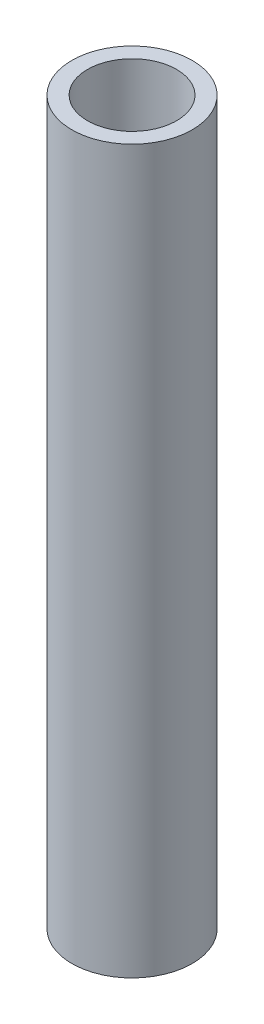
ISO-10303-21;
HEADER;
FILE_DESCRIPTION(('STEP AP214'),'2;1');
FILE_NAME('part.step','',(''),(''),'','','');
FILE_SCHEMA(('AUTOMOTIVE_DESIGN { 1 0 10303 214 1 1 1 1 }'));
ENDSEC;
DATA;
#1=APPLICATION_CONTEXT('core data for automotive mechanical design processes');
#2=APPLICATION_PROTOCOL_DEFINITION('international standard','automotive_design',2000,#1);
#3=PRODUCT_CONTEXT('',#1,'mechanical');
#4=PRODUCT('Part','Part','',(#3));
#5=PRODUCT_RELATED_PRODUCT_CATEGORY('part','',(#4));
#6=PRODUCT_DEFINITION_FORMATION('','',#4);
#7=PRODUCT_DEFINITION_CONTEXT('part definition',#1,'design');
#8=PRODUCT_DEFINITION('design','',#6,#7);
#9=PRODUCT_DEFINITION_SHAPE('','',#8);
#10=(LENGTH_UNIT() NAMED_UNIT(*) SI_UNIT(.MILLI.,.METRE.));
#11=(NAMED_UNIT(*) PLANE_ANGLE_UNIT() SI_UNIT($,.RADIAN.));
#12=(NAMED_UNIT(*) SI_UNIT($,.STERADIAN.) SOLID_ANGLE_UNIT());
#13=UNCERTAINTY_MEASURE_WITH_UNIT(LENGTH_MEASURE(1.E-05),#10,'distance_accuracy_value','');
#14=(GEOMETRIC_REPRESENTATION_CONTEXT(3) GLOBAL_UNCERTAINTY_ASSIGNED_CONTEXT((#13)) GLOBAL_UNIT_ASSIGNED_CONTEXT((#10,
#11,#12)) REPRESENTATION_CONTEXT('',''));
#15=CARTESIAN_POINT('',(0.,0.,0.));
#16=DIRECTION('',(0.,0.,1.));
#17=DIRECTION('',(1.,0.,0.));
#18=AXIS2_PLACEMENT_3D('',#15,#16,#17);
#19=CARTESIAN_POINT('',(0.,76.2,0.));
#20=DIRECTION('',(0.,1.,0.));
#21=DIRECTION('',(0.,0.,1.));
#22=AXIS2_PLACEMENT_3D('',#19,#20,#21);
#23=PLANE('',#22);
#24=CARTESIAN_POINT('',(0.,76.2,0.));
#25=DIRECTION('',(0.,1.,0.));
#26=DIRECTION('',(0.,0.,1.));
#27=AXIS2_PLACEMENT_3D('',#24,#25,#26);
#28=CIRCLE('',#27,6.35);
#29=CARTESIAN_POINT('',(0.,76.2,-6.35));
#30=VERTEX_POINT('',#29);
#31=EDGE_CURVE('E10',#30,#30,#28,.T.);
#32=ORIENTED_EDGE('',*,*,#31,.T.);
#33=EDGE_LOOP('',(#32));
#34=FACE_BOUND('',#33,.T.);
#35=CARTESIAN_POINT('',(0.,76.2,0.));
#36=DIRECTION('',(0.,1.,0.));
#37=DIRECTION('',(0.,0.,1.));
#38=AXIS2_PLACEMENT_3D('',#35,#36,#37);
#39=CIRCLE('',#38,4.699);
#40=CARTESIAN_POINT('',(0.,76.2,-4.699));
#41=VERTEX_POINT('',#40);
#42=EDGE_CURVE('E42',#41,#41,#39,.T.);
#43=ORIENTED_EDGE('',*,*,#42,.F.);
#44=EDGE_LOOP('',(#43));
#45=FACE_BOUND('',#44,.T.);
#46=ADVANCED_FACE('F31',(#34,#45),#23,.T.);
#47=CARTESIAN_POINT('',(0.,0.,0.));
#48=DIRECTION('',(0.,1.,0.));
#49=DIRECTION('',(0.,0.,1.));
#50=AXIS2_PLACEMENT_3D('',#47,#48,#49);
#51=PLANE('',#50);
#52=CARTESIAN_POINT('',(0.,0.,0.));
#53=DIRECTION('',(0.,1.,0.));
#54=DIRECTION('',(0.,0.,1.));
#55=AXIS2_PLACEMENT_3D('',#52,#53,#54);
#56=CIRCLE('',#55,6.35);
#57=CARTESIAN_POINT('',(0.,0.,-6.35));
#58=VERTEX_POINT('',#57);
#59=EDGE_CURVE('E35',#58,#58,#56,.T.);
#60=ORIENTED_EDGE('',*,*,#59,.F.);
#61=EDGE_LOOP('',(#60));
#62=FACE_BOUND('',#61,.T.);
#63=CARTESIAN_POINT('',(0.,0.,0.));
#64=DIRECTION('',(0.,1.,0.));
#65=DIRECTION('',(0.,0.,1.));
#66=AXIS2_PLACEMENT_3D('',#63,#64,#65);
#67=CIRCLE('',#66,4.699);
#68=CARTESIAN_POINT('',(0.,0.,-4.699));
#69=VERTEX_POINT('',#68);
#70=EDGE_CURVE('E44',#69,#69,#67,.T.);
#71=ORIENTED_EDGE('',*,*,#70,.T.);
#72=EDGE_LOOP('',(#71));
#73=FACE_BOUND('',#72,.T.);
#74=ADVANCED_FACE('F54',(#62,#73),#51,.F.);
#75=CARTESIAN_POINT('',(0.,76.2,0.));
#76=DIRECTION('',(0.,-1.,0.));
#77=DIRECTION('',(0.,0.,-1.));
#78=AXIS2_PLACEMENT_3D('',#75,#76,#77);
#79=CYLINDRICAL_SURFACE('',#78,6.35);
#80=CARTESIAN_POINT('',(0.,76.2,-6.35));
#81=CARTESIAN_POINT('',(0.,75.40625,-6.35));
#82=CARTESIAN_POINT('',(0.,74.6125,-6.35));
#83=CARTESIAN_POINT('',(0.,73.025,-6.35));
#84=CARTESIAN_POINT('',(0.,72.23125,-6.35));
#85=CARTESIAN_POINT('',(0.,70.64375,-6.35));
#86=CARTESIAN_POINT('',(0.,69.85,-6.35));
#87=CARTESIAN_POINT('',(0.,68.2625,-6.35));
#88=CARTESIAN_POINT('',(0.,67.46875,-6.35));
#89=CARTESIAN_POINT('',(0.,65.88125,-6.35));
#90=CARTESIAN_POINT('',(0.,65.0875,-6.35));
#91=CARTESIAN_POINT('',(0.,63.5,-6.35));
#92=CARTESIAN_POINT('',(0.,62.70625,-6.35));
#93=CARTESIAN_POINT('',(0.,61.11875,-6.35));
#94=CARTESIAN_POINT('',(0.,60.325,-6.35));
#95=CARTESIAN_POINT('',(0.,58.7375,-6.35));
#96=CARTESIAN_POINT('',(0.,57.94375,-6.35));
#97=CARTESIAN_POINT('',(0.,56.35625,-6.35));
#98=CARTESIAN_POINT('',(0.,55.5625,-6.35));
#99=CARTESIAN_POINT('',(0.,53.975,-6.35));
#100=CARTESIAN_POINT('',(0.,53.18125,-6.35));
#101=CARTESIAN_POINT('',(0.,51.59375,-6.35));
#102=CARTESIAN_POINT('',(0.,50.8,-6.35));
#103=CARTESIAN_POINT('',(0.,49.2125,-6.35));
#104=CARTESIAN_POINT('',(0.,48.41875,-6.35));
#105=CARTESIAN_POINT('',(0.,46.83125,-6.35));
#106=CARTESIAN_POINT('',(0.,46.0375,-6.35));
#107=CARTESIAN_POINT('',(0.,44.45,-6.35));
#108=CARTESIAN_POINT('',(0.,43.65625,-6.35));
#109=CARTESIAN_POINT('',(0.,42.06875,-6.35));
#110=CARTESIAN_POINT('',(0.,41.275,-6.35));
#111=CARTESIAN_POINT('',(0.,39.6875,-6.35));
#112=CARTESIAN_POINT('',(0.,38.89375,-6.35));
#113=CARTESIAN_POINT('',(0.,37.30625,-6.35));
#114=CARTESIAN_POINT('',(0.,36.5125,-6.35));
#115=CARTESIAN_POINT('',(0.,34.925,-6.35));
#116=CARTESIAN_POINT('',(0.,34.13125,-6.35));
#117=CARTESIAN_POINT('',(0.,32.54375,-6.35));
#118=CARTESIAN_POINT('',(0.,31.75,-6.35));
#119=CARTESIAN_POINT('',(0.,30.1625,-6.35));
#120=CARTESIAN_POINT('',(0.,29.36875,-6.35));
#121=CARTESIAN_POINT('',(0.,27.78125,-6.35));
#122=CARTESIAN_POINT('',(0.,26.9875,-6.35));
#123=CARTESIAN_POINT('',(0.,25.4,-6.35));
#124=CARTESIAN_POINT('',(0.,24.60625,-6.35));
#125=CARTESIAN_POINT('',(0.,23.01875,-6.35));
#126=CARTESIAN_POINT('',(0.,22.225,-6.35));
#127=CARTESIAN_POINT('',(0.,20.6375,-6.35));
#128=CARTESIAN_POINT('',(0.,19.84375,-6.35));
#129=CARTESIAN_POINT('',(0.,18.25625,-6.35));
#130=CARTESIAN_POINT('',(0.,17.4625,-6.35));
#131=CARTESIAN_POINT('',(0.,15.875,-6.35));
#132=CARTESIAN_POINT('',(0.,15.08125,-6.35));
#133=CARTESIAN_POINT('',(0.,13.49375,-6.35));
#134=CARTESIAN_POINT('',(0.,12.7,-6.35));
#135=CARTESIAN_POINT('',(0.,11.1125,-6.35));
#136=CARTESIAN_POINT('',(0.,10.31875,-6.35));
#137=CARTESIAN_POINT('',(0.,8.73125,-6.35));
#138=CARTESIAN_POINT('',(0.,7.93750000000001,-6.35));
#139=CARTESIAN_POINT('',(0.,6.35,-6.35));
#140=CARTESIAN_POINT('',(0.,5.55625,-6.35));
#141=CARTESIAN_POINT('',(0.,3.96875,-6.35));
#142=CARTESIAN_POINT('',(0.,3.175,-6.35));
#143=CARTESIAN_POINT('',(0.,1.5875,-6.35));
#144=CARTESIAN_POINT('',(0.,0.793750000000001,-6.35));
#145=CARTESIAN_POINT('',(0.,0.,-6.35));
#146=B_SPLINE_CURVE_WITH_KNOTS('',3,(#80,#81,#82,#83,#84,#85,#86,#87,#88,#89,#90,#91,#92,#93,
#94,#95,#96,#97,#98,#99,#100,#101,#102,#103,#104,#105,#106,#107,#108,#109,#110,#111,#112,#113,
#114,#115,#116,#117,#118,#119,#120,#121,#122,#123,#124,#125,#126,#127,#128,#129,#130,#131,#132,
#133,#134,#135,#136,#137,#138,#139,#140,#141,#142,#143,#144,#145),.UNSPECIFIED.,.F.,.F.,(4,2,2,
2,2,2,2,2,2,2,2,2,2,2,2,2,2,2,2,2,2,2,2,2,2,2,2,2,2,2,2,2,4),(0.,2.38124999999999,
4.76249999999999,7.14374999999999,9.52499999999999,11.90625,14.2875,16.66875,19.05,21.43125,
23.8125,26.19375,28.575,30.95625,33.3375,35.71875,38.1,40.48125,42.8625,45.24375,47.625,
50.00625,52.3875,54.76875,57.15,59.53125,61.9125,64.29375,66.675,69.05625,71.4375,73.81875,
76.2),.UNSPECIFIED.);
#147=EDGE_CURVE('BSEAM33',#30,#58,#146,.T.);
#148=ORIENTED_EDGE('',*,*,#31,.F.);
#149=ORIENTED_EDGE('',*,*,#59,.T.);
#150=ORIENTED_EDGE('',*,*,#147,.T.);
#151=ORIENTED_EDGE('',*,*,#147,.F.);
#152=EDGE_LOOP('',(#148,#150,#149,#151));
#153=FACE_BOUND('',#152,.T.);
#154=ADVANCED_FACE('F33',(#153),#79,.T.);
#155=CARTESIAN_POINT('',(0.,76.2,0.));
#156=DIRECTION('',(0.,-1.,0.));
#157=DIRECTION('',(0.,0.,-1.));
#158=AXIS2_PLACEMENT_3D('',#155,#156,#157);
#159=CYLINDRICAL_SURFACE('',#158,4.699);
#160=CARTESIAN_POINT('',(0.,76.2,-4.699));
#161=CARTESIAN_POINT('',(0.,75.40625,-4.699));
#162=CARTESIAN_POINT('',(0.,74.6125,-4.699));
#163=CARTESIAN_POINT('',(0.,73.025,-4.699));
#164=CARTESIAN_POINT('',(0.,72.23125,-4.699));
#165=CARTESIAN_POINT('',(0.,70.64375,-4.699));
#166=CARTESIAN_POINT('',(0.,69.85,-4.699));
#167=CARTESIAN_POINT('',(0.,68.2625,-4.699));
#168=CARTESIAN_POINT('',(0.,67.46875,-4.699));
#169=CARTESIAN_POINT('',(0.,65.88125,-4.699));
#170=CARTESIAN_POINT('',(0.,65.0875,-4.699));
#171=CARTESIAN_POINT('',(0.,63.5,-4.699));
#172=CARTESIAN_POINT('',(0.,62.70625,-4.699));
#173=CARTESIAN_POINT('',(0.,61.11875,-4.699));
#174=CARTESIAN_POINT('',(0.,60.325,-4.699));
#175=CARTESIAN_POINT('',(0.,58.7375,-4.699));
#176=CARTESIAN_POINT('',(0.,57.94375,-4.699));
#177=CARTESIAN_POINT('',(0.,56.35625,-4.699));
#178=CARTESIAN_POINT('',(0.,55.5625,-4.699));
#179=CARTESIAN_POINT('',(0.,53.975,-4.699));
#180=CARTESIAN_POINT('',(0.,53.18125,-4.699));
#181=CARTESIAN_POINT('',(0.,51.59375,-4.699));
#182=CARTESIAN_POINT('',(0.,50.8,-4.699));
#183=CARTESIAN_POINT('',(0.,49.2125,-4.699));
#184=CARTESIAN_POINT('',(0.,48.41875,-4.699));
#185=CARTESIAN_POINT('',(0.,46.83125,-4.699));
#186=CARTESIAN_POINT('',(0.,46.0375,-4.699));
#187=CARTESIAN_POINT('',(0.,44.45,-4.699));
#188=CARTESIAN_POINT('',(0.,43.65625,-4.699));
#189=CARTESIAN_POINT('',(0.,42.06875,-4.699));
#190=CARTESIAN_POINT('',(0.,41.275,-4.699));
#191=CARTESIAN_POINT('',(0.,39.6875,-4.699));
#192=CARTESIAN_POINT('',(0.,38.89375,-4.699));
#193=CARTESIAN_POINT('',(0.,37.30625,-4.699));
#194=CARTESIAN_POINT('',(0.,36.5125,-4.699));
#195=CARTESIAN_POINT('',(0.,34.925,-4.699));
#196=CARTESIAN_POINT('',(0.,34.13125,-4.699));
#197=CARTESIAN_POINT('',(0.,32.54375,-4.699));
#198=CARTESIAN_POINT('',(0.,31.75,-4.699));
#199=CARTESIAN_POINT('',(0.,30.1625,-4.699));
#200=CARTESIAN_POINT('',(0.,29.36875,-4.699));
#201=CARTESIAN_POINT('',(0.,27.78125,-4.699));
#202=CARTESIAN_POINT('',(0.,26.9875,-4.699));
#203=CARTESIAN_POINT('',(0.,25.4,-4.699));
#204=CARTESIAN_POINT('',(0.,24.60625,-4.699));
#205=CARTESIAN_POINT('',(0.,23.01875,-4.699));
#206=CARTESIAN_POINT('',(0.,22.225,-4.699));
#207=CARTESIAN_POINT('',(0.,20.6375,-4.699));
#208=CARTESIAN_POINT('',(0.,19.84375,-4.699));
#209=CARTESIAN_POINT('',(0.,18.25625,-4.699));
#210=CARTESIAN_POINT('',(0.,17.4625,-4.699));
#211=CARTESIAN_POINT('',(0.,15.875,-4.699));
#212=CARTESIAN_POINT('',(0.,15.08125,-4.699));
#213=CARTESIAN_POINT('',(0.,13.49375,-4.699));
#214=CARTESIAN_POINT('',(0.,12.7,-4.699));
#215=CARTESIAN_POINT('',(0.,11.1125,-4.699));
#216=CARTESIAN_POINT('',(0.,10.31875,-4.699));
#217=CARTESIAN_POINT('',(0.,8.73125,-4.699));
#218=CARTESIAN_POINT('',(0.,7.93750000000001,-4.699));
#219=CARTESIAN_POINT('',(0.,6.35,-4.699));
#220=CARTESIAN_POINT('',(0.,5.55625,-4.699));
#221=CARTESIAN_POINT('',(0.,3.96875,-4.699));
#222=CARTESIAN_POINT('',(0.,3.175,-4.699));
#223=CARTESIAN_POINT('',(0.,1.5875,-4.699));
#224=CARTESIAN_POINT('',(0.,0.793750000000001,-4.699));
#225=CARTESIAN_POINT('',(0.,0.,-4.699));
#226=B_SPLINE_CURVE_WITH_KNOTS('',3,(#160,#161,#162,#163,#164,#165,#166,#167,#168,#169,#170,
#171,#172,#173,#174,#175,#176,#177,#178,#179,#180,#181,#182,#183,#184,#185,#186,#187,#188,#189,
#190,#191,#192,#193,#194,#195,#196,#197,#198,#199,#200,#201,#202,#203,#204,#205,#206,#207,#208,
#209,#210,#211,#212,#213,#214,#215,#216,#217,#218,#219,#220,#221,#222,#223,#224,#225),
.UNSPECIFIED.,.F.,.F.,(4,2,2,2,2,2,2,2,2,2,2,2,2,2,2,2,2,2,2,2,2,2,2,2,2,2,2,2,2,2,2,2,4),(0.,
2.38125,4.7625,7.14375,9.52500000000001,11.90625,14.2875,16.66875,19.05,21.43125,23.8125,
26.19375,28.575,30.95625,33.3375,35.71875,38.1,40.48125,42.8625,45.24375,47.625,50.00625,
52.3875,54.76875,57.15,59.53125,61.9125,64.29375,66.675,69.05625,71.4375,73.81875,76.2),.UNSPECIFIED.);
#227=EDGE_CURVE('BSEAM50',#41,#69,#226,.T.);
#228=ORIENTED_EDGE('',*,*,#42,.T.);
#229=ORIENTED_EDGE('',*,*,#70,.F.);
#230=ORIENTED_EDGE('',*,*,#227,.T.);
#231=ORIENTED_EDGE('',*,*,#227,.F.);
#232=EDGE_LOOP('',(#228,#230,#229,#231));
#233=FACE_BOUND('',#232,.T.);
#234=ADVANCED_FACE('F50',(#233),#159,.F.);
#235=CLOSED_SHELL('',(#46,#74,#154,#234));
#236=MANIFOLD_SOLID_BREP('B2',#235);
#237=ADVANCED_BREP_SHAPE_REPRESENTATION('',(#18,#236),#14);
#238=SHAPE_DEFINITION_REPRESENTATION(#9,#237);
ENDSEC;
END-ISO-10303-21;
